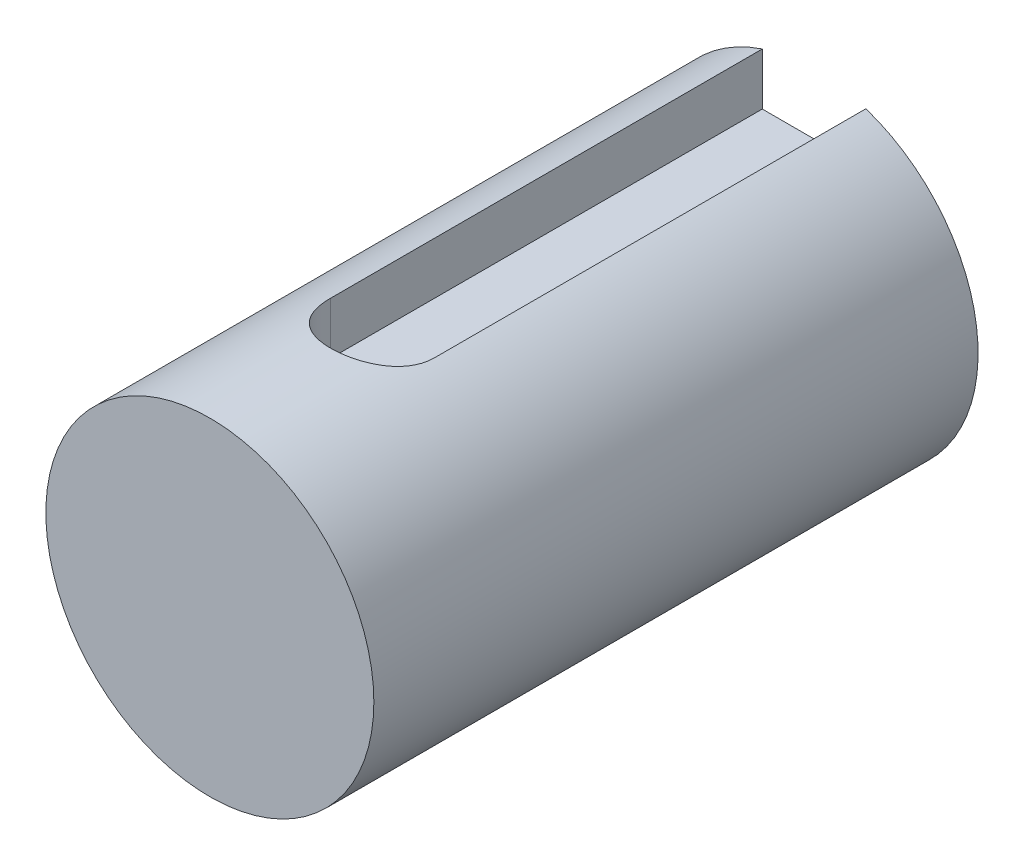
ISO-10303-21;
HEADER;
FILE_DESCRIPTION(('STEP AP214'),'2;1');
FILE_NAME('part.step','',(''),(''),'','','');
FILE_SCHEMA(('AUTOMOTIVE_DESIGN { 1 0 10303 214 1 1 1 1 }'));
ENDSEC;
DATA;
#1=APPLICATION_CONTEXT('core data for automotive mechanical design processes');
#2=APPLICATION_PROTOCOL_DEFINITION('international standard','automotive_design',2000,#1);
#3=PRODUCT_CONTEXT('',#1,'mechanical');
#4=PRODUCT('Part','Part','',(#3));
#5=PRODUCT_RELATED_PRODUCT_CATEGORY('part','',(#4));
#6=PRODUCT_DEFINITION_FORMATION('','',#4);
#7=PRODUCT_DEFINITION_CONTEXT('part definition',#1,'design');
#8=PRODUCT_DEFINITION('design','',#6,#7);
#9=PRODUCT_DEFINITION_SHAPE('','',#8);
#10=(LENGTH_UNIT() NAMED_UNIT(*) SI_UNIT(.MILLI.,.METRE.));
#11=(NAMED_UNIT(*) PLANE_ANGLE_UNIT() SI_UNIT($,.RADIAN.));
#12=(NAMED_UNIT(*) SI_UNIT($,.STERADIAN.) SOLID_ANGLE_UNIT());
#13=UNCERTAINTY_MEASURE_WITH_UNIT(LENGTH_MEASURE(1.E-05),#10,'distance_accuracy_value','');
#14=(GEOMETRIC_REPRESENTATION_CONTEXT(3) GLOBAL_UNCERTAINTY_ASSIGNED_CONTEXT((#13)) GLOBAL_UNIT_ASSIGNED_CONTEXT((#10,
#11,#12)) REPRESENTATION_CONTEXT('',''));
#15=CARTESIAN_POINT('',(0.,0.,0.));
#16=DIRECTION('',(0.,0.,1.));
#17=DIRECTION('',(1.,0.,0.));
#18=AXIS2_PLACEMENT_3D('',#15,#16,#17);
#19=CARTESIAN_POINT('',(0.,0.,35.));
#20=DIRECTION('',(0.,0.,-1.));
#21=DIRECTION('',(-1.,0.,0.));
#22=AXIS2_PLACEMENT_3D('',#19,#20,#21);
#23=CYLINDRICAL_SURFACE('',#22,9.5);
#24=CARTESIAN_POINT('',(0.,0.,35.));
#25=DIRECTION('',(0.,0.,1.));
#26=DIRECTION('',(1.,0.,0.));
#27=AXIS2_PLACEMENT_3D('',#24,#25,#26);
#28=CIRCLE('',#27,9.5);
#29=CARTESIAN_POINT('',(9.5,0.,35.));
#30=VERTEX_POINT('',#29);
#31=EDGE_CURVE('E47',#30,#30,#28,.T.);
#32=ORIENTED_EDGE('',*,*,#31,.F.);
#33=EDGE_LOOP('',(#32));
#34=FACE_BOUND('',#33,.T.);
#35=CARTESIAN_POINT('',(0.,0.,0.));
#36=DIRECTION('',(0.,0.,1.));
#37=DIRECTION('',(1.,0.,0.));
#38=AXIS2_PLACEMENT_3D('',#35,#36,#37);
#39=CIRCLE('',#38,9.5);
#40=CARTESIAN_POINT('',(-3.,9.01387818865997,0.));
#41=VERTEX_POINT('',#40);
#42=CARTESIAN_POINT('',(3.,9.01387818865997,0.));
#43=VERTEX_POINT('',#42);
#44=EDGE_CURVE('E100',#41,#43,#39,.T.);
#45=ORIENTED_EDGE('',*,*,#44,.T.);
#46=DIRECTION('',(0.,0.,-1.));
#47=VECTOR('',#46,1.);
#48=CARTESIAN_POINT('',(3.,9.01387818865997,35.));
#49=LINE('',#48,#47);
#50=CARTESIAN_POINT('',(3.,9.01387818865997,25.));
#51=VERTEX_POINT('',#50);
#52=EDGE_CURVE('E61',#43,#51,#49,.F.);
#53=ORIENTED_EDGE('',*,*,#52,.T.);
#54=CARTESIAN_POINT('',(3.,9.01387818865997,25.));
#55=CARTESIAN_POINT('',(3.00001051385875,9.0138659797526,25.0821115960639));
#56=CARTESIAN_POINT('',(2.99662905660006,9.01499989454476,25.1642162817493));
#57=CARTESIAN_POINT('',(2.98316404654784,9.01946917046719,25.3277943400374));
#58=CARTESIAN_POINT('',(2.97308213853192,9.02280399133373,25.4092678626093));
#59=CARTESIAN_POINT('',(2.94633448610861,9.03157240009613,25.5707866587447));
#60=CARTESIAN_POINT('',(2.92968675404814,9.03700024519574,25.6508352187801));
#61=CARTESIAN_POINT('',(2.88997412625353,9.04977799868353,25.8091467122219));
#62=CARTESIAN_POINT('',(2.86690903351726,9.05712796607721,25.887409590731));
#63=CARTESIAN_POINT('',(2.78838156526383,9.08173850222865,26.1186413211253));
#64=CARTESIAN_POINT('',(2.72354999703843,9.10157261467588,26.2682741608753));
#65=CARTESIAN_POINT('',(2.57094386716857,9.14584733119862,26.5545497418246));
#66=CARTESIAN_POINT('',(2.48315705146955,9.17029039369115,26.6911854915794));
#67=CARTESIAN_POINT('',(2.2838388747468,9.22198403617594,26.9524081667219));
#68=CARTESIAN_POINT('',(2.17164444485387,9.24929895371902,27.0764774535989));
#69=CARTESIAN_POINT('',(1.92811437393957,9.30311268555823,27.3043874875415));
#70=CARTESIAN_POINT('',(1.79677542963294,9.32961135805786,27.4082247364357));
#71=CARTESIAN_POINT('',(1.51492697197699,9.37954779995869,27.5950383500792));
#72=CARTESIAN_POINT('',(1.36404405189943,9.40290050967596,27.6774761453684));
#73=CARTESIAN_POINT('',(1.049697625243,9.44315613757947,27.815596867648));
#74=CARTESIAN_POINT('',(0.886237652558046,9.46006085962261,27.871287278485));
#75=CARTESIAN_POINT('',(0.556831203418085,9.48505937073961,27.9525930196885));
#76=CARTESIAN_POINT('',(0.391124861418222,9.49341369798659,27.9790996588489));
#77=CARTESIAN_POINT('',(0.0574168559885838,9.50129109936277,28.0041110455854));
#78=CARTESIAN_POINT('',(-0.110584313695136,9.50081604418683,28.0026217247077));
#79=CARTESIAN_POINT('',(-0.437828173835971,9.49126851976805,27.9722655146535));
#80=CARTESIAN_POINT('',(-0.597170843199384,9.48249971513205,27.9443655846099));
#81=CARTESIAN_POINT('',(-0.908782395328051,9.45772480432466,27.8635690606951));
#82=CARTESIAN_POINT('',(-1.06105089506543,9.44171830677393,27.8106711150454));
#83=CARTESIAN_POINT('',(-1.35640803150265,9.40386197703309,27.680767354096));
#84=CARTESIAN_POINT('',(-1.4993594227709,9.38194214767498,27.6034707307093));
#85=CARTESIAN_POINT('',(-1.77055948131571,9.33456474814701,27.4271982474181));
#86=CARTESIAN_POINT('',(-1.89880450317321,9.309106304269,27.3282170299507));
#87=CARTESIAN_POINT('',(-2.14270544761004,9.25608223599561,27.1064468791733));
#88=CARTESIAN_POINT('',(-2.25759649164401,9.22847303653709,26.9828260839732));
#89=CARTESIAN_POINT('',(-2.46526929661821,9.17518254568078,26.7177872091504));
#90=CARTESIAN_POINT('',(-2.55804433064725,9.14950184248643,26.576363734516));
#91=CARTESIAN_POINT('',(-2.71978065912097,9.10274637641722,26.2775051791214));
#92=CARTESIAN_POINT('',(-2.78843918651111,9.08173131348828,26.1198965627582));
#93=CARTESIAN_POINT('',(-2.89791755194282,9.04739847439928,25.7946131192133));
#94=CARTESIAN_POINT('',(-2.93878053127324,9.0340687747604,25.6269543330248));
#95=CARTESIAN_POINT('',(-2.97664323444399,9.02162485672095,25.3814118065919));
#96=CARTESIAN_POINT('',(-2.98539986566241,9.01872707446656,25.3053703596187));
#97=CARTESIAN_POINT('',(-2.99707362962925,9.01485301694164,25.1528991195762));
#98=CARTESIAN_POINT('',(-2.99999890907284,9.01387406100515,25.0764700180501));
#99=CARTESIAN_POINT('',(-3.,9.01387818865997,25.));
#100=B_SPLINE_CURVE_WITH_KNOTS('',3,(#54,#55,#56,#57,#58,#59,#60,#61,#62,#63,#64,#65,#66,#67,
#68,#69,#70,#71,#72,#73,#74,#75,#76,#77,#78,#79,#80,#81,#82,#83,#84,#85,#86,#87,#88,#89,#90,#91,
#92,#93,#94,#95,#96,#97,#98,#99),.UNSPECIFIED.,.F.,.F.,(4,2,2,2,2,2,2,2,2,2,2,2,2,2,2,2,2,2,2,2,
2,2,4),(0.,0.246245637852727,0.492430851444291,0.737945339070648,0.983467364408605,
1.47384684625803,1.9644886406001,2.47064554646562,2.97688989065071,3.49485361930968,
4.01267233855414,4.5141953101691,5.01561202455116,5.49935290070998,5.98311993835789,
6.47288577409975,6.96277275190332,7.47344235565184,7.98426708947913,8.50129313971749,
9.01751487485065,9.2471031308651,9.47637041498352),.UNSPECIFIED.);
#101=CARTESIAN_POINT('',(-3.,9.01387818865997,25.));
#102=VERTEX_POINT('',#101);
#103=EDGE_CURVE('E11',#51,#102,#100,.T.);
#104=ORIENTED_EDGE('',*,*,#103,.T.);
#105=DIRECTION('',(0.,0.,-1.));
#106=VECTOR('',#105,1.);
#107=CARTESIAN_POINT('',(-3.,9.01387818865997,35.));
#108=LINE('',#107,#106);
#109=EDGE_CURVE('E107',#102,#41,#108,.T.);
#110=ORIENTED_EDGE('',*,*,#109,.T.);
#111=EDGE_LOOP('',(#45,#53,#104,#110));
#112=FACE_BOUND('',#111,.T.);
#113=ADVANCED_FACE('F34',(#34,#112),#23,.T.);
#114=CARTESIAN_POINT('',(0.,0.,35.));
#115=DIRECTION('',(0.,0.,1.));
#116=DIRECTION('',(1.,0.,0.));
#117=AXIS2_PLACEMENT_3D('',#114,#115,#116);
#118=PLANE('',#117);
#119=ORIENTED_EDGE('',*,*,#31,.T.);
#120=EDGE_LOOP('',(#119));
#121=FACE_BOUND('',#120,.T.);
#122=ADVANCED_FACE('F127',(#121),#118,.T.);
#123=CARTESIAN_POINT('',(0.,0.,0.));
#124=DIRECTION('',(0.,0.,1.));
#125=DIRECTION('',(1.,0.,0.));
#126=AXIS2_PLACEMENT_3D('',#123,#124,#125);
#127=PLANE('',#126);
#128=DIRECTION('',(-1.,0.,0.));
#129=VECTOR('',#128,1.);
#130=CARTESIAN_POINT('',(-3.,6.,0.));
#131=LINE('',#130,#129);
#132=CARTESIAN_POINT('',(3.,6.,0.));
#133=VERTEX_POINT('',#132);
#134=CARTESIAN_POINT('',(-3.,6.,0.));
#135=VERTEX_POINT('',#134);
#136=EDGE_CURVE('E91',#133,#135,#131,.T.);
#137=ORIENTED_EDGE('',*,*,#136,.F.);
#138=DIRECTION('',(0.,1.,0.));
#139=VECTOR('',#138,1.);
#140=CARTESIAN_POINT('',(3.,6.,0.));
#141=LINE('',#140,#139);
#142=EDGE_CURVE('E109',#133,#43,#141,.T.);
#143=ORIENTED_EDGE('',*,*,#142,.T.);
#144=ORIENTED_EDGE('',*,*,#44,.F.);
#145=DIRECTION('',(0.,1.,0.));
#146=VECTOR('',#145,1.);
#147=CARTESIAN_POINT('',(-3.,6.,0.));
#148=LINE('',#147,#146);
#149=EDGE_CURVE('E85',#135,#41,#148,.T.);
#150=ORIENTED_EDGE('',*,*,#149,.F.);
#151=EDGE_LOOP('',(#137,#143,#144,#150));
#152=FACE_BOUND('',#151,.T.);
#153=ADVANCED_FACE('F98',(#152),#127,.F.);
#154=CARTESIAN_POINT('',(0.,6.,25.));
#155=DIRECTION('',(0.,1.,0.));
#156=DIRECTION('',(0.,0.,1.));
#157=AXIS2_PLACEMENT_3D('',#154,#155,#156);
#158=CYLINDRICAL_SURFACE('',#157,3.);
#159=DIRECTION('',(0.,1.,0.));
#160=VECTOR('',#159,1.);
#161=CARTESIAN_POINT('',(3.,6.,25.));
#162=LINE('',#161,#160);
#163=CARTESIAN_POINT('',(3.,6.,25.));
#164=VERTEX_POINT('',#163);
#165=EDGE_CURVE('E102',#164,#51,#162,.T.);
#166=ORIENTED_EDGE('',*,*,#165,.F.);
#167=CARTESIAN_POINT('',(0.,6.,25.));
#168=DIRECTION('',(0.,1.,0.));
#169=DIRECTION('',(0.,0.,-1.));
#170=AXIS2_PLACEMENT_3D('',#167,#168,#169);
#171=CIRCLE('',#170,3.);
#172=CARTESIAN_POINT('',(-3.,6.,25.));
#173=VERTEX_POINT('',#172);
#174=EDGE_CURVE('E90',#173,#164,#171,.T.);
#175=ORIENTED_EDGE('',*,*,#174,.F.);
#176=DIRECTION('',(0.,1.,0.));
#177=VECTOR('',#176,1.);
#178=CARTESIAN_POINT('',(-3.,6.,25.));
#179=LINE('',#178,#177);
#180=EDGE_CURVE('E88',#173,#102,#179,.T.);
#181=ORIENTED_EDGE('',*,*,#180,.T.);
#182=ORIENTED_EDGE('',*,*,#103,.F.);
#183=EDGE_LOOP('',(#166,#175,#181,#182));
#184=FACE_BOUND('',#183,.T.);
#185=ADVANCED_FACE('F114',(#184),#158,.F.);
#186=CARTESIAN_POINT('',(3.,6.,0.));
#187=DIRECTION('',(1.,0.,0.));
#188=DIRECTION('',(0.,0.,-1.));
#189=AXIS2_PLACEMENT_3D('',#186,#187,#188);
#190=PLANE('',#189);
#191=ORIENTED_EDGE('',*,*,#142,.F.);
#192=DIRECTION('',(0.,0.,-1.));
#193=VECTOR('',#192,1.);
#194=CARTESIAN_POINT('',(3.,6.,0.));
#195=LINE('',#194,#193);
#196=EDGE_CURVE('E54',#164,#133,#195,.T.);
#197=ORIENTED_EDGE('',*,*,#196,.F.);
#198=ORIENTED_EDGE('',*,*,#165,.T.);
#199=ORIENTED_EDGE('',*,*,#52,.F.);
#200=EDGE_LOOP('',(#191,#197,#198,#199));
#201=FACE_BOUND('',#200,.T.);
#202=ADVANCED_FACE('F117',(#201),#190,.F.);
#203=CARTESIAN_POINT('',(-3.,6.,25.));
#204=DIRECTION('',(-1.,0.,0.));
#205=DIRECTION('',(0.,0.,1.));
#206=AXIS2_PLACEMENT_3D('',#203,#204,#205);
#207=PLANE('',#206);
#208=ORIENTED_EDGE('',*,*,#180,.F.);
#209=DIRECTION('',(0.,0.,1.));
#210=VECTOR('',#209,1.);
#211=CARTESIAN_POINT('',(-3.,6.,25.));
#212=LINE('',#211,#210);
#213=EDGE_CURVE('E82',#135,#173,#212,.T.);
#214=ORIENTED_EDGE('',*,*,#213,.F.);
#215=ORIENTED_EDGE('',*,*,#149,.T.);
#216=ORIENTED_EDGE('',*,*,#109,.F.);
#217=EDGE_LOOP('',(#208,#214,#215,#216));
#218=FACE_BOUND('',#217,.T.);
#219=ADVANCED_FACE('F83',(#218),#207,.F.);
#220=CARTESIAN_POINT('',(0.,6.,25.));
#221=DIRECTION('',(0.,-1.,0.));
#222=DIRECTION('',(0.,0.,-1.));
#223=AXIS2_PLACEMENT_3D('',#220,#221,#222);
#224=PLANE('',#223);
#225=ORIENTED_EDGE('',*,*,#136,.T.);
#226=ORIENTED_EDGE('',*,*,#213,.T.);
#227=ORIENTED_EDGE('',*,*,#174,.T.);
#228=ORIENTED_EDGE('',*,*,#196,.T.);
#229=EDGE_LOOP('',(#225,#226,#227,#228));
#230=FACE_BOUND('',#229,.T.);
#231=ADVANCED_FACE('F94',(#230),#224,.F.);
#232=CLOSED_SHELL('',(#113,#122,#153,#185,#202,#219,#231));
#233=MANIFOLD_SOLID_BREP('B2',#232);
#234=ADVANCED_BREP_SHAPE_REPRESENTATION('',(#18,#233),#14);
#235=SHAPE_DEFINITION_REPRESENTATION(#9,#234);
ENDSEC;
END-ISO-10303-21;
